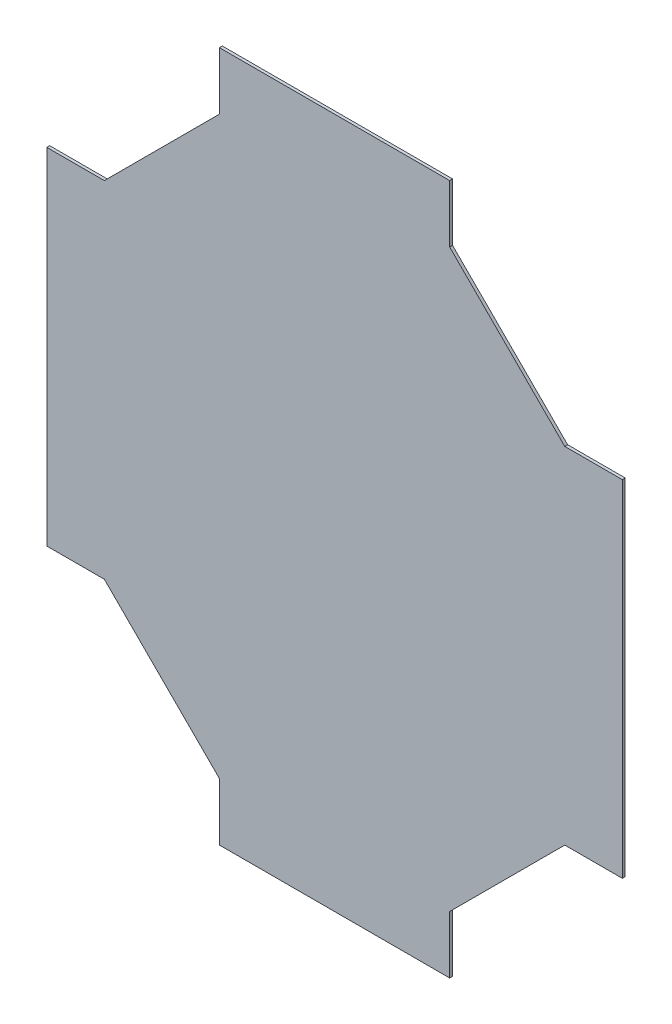
ISO-10303-21;
HEADER;
FILE_DESCRIPTION(('STEP AP214'),'2;1');
FILE_NAME('part.step','',(''),(''),'','','');
FILE_SCHEMA(('AUTOMOTIVE_DESIGN { 1 0 10303 214 1 1 1 1 }'));
ENDSEC;
DATA;
#1=APPLICATION_CONTEXT('core data for automotive mechanical design processes');
#2=APPLICATION_PROTOCOL_DEFINITION('international standard','automotive_design',2000,#1);
#3=PRODUCT_CONTEXT('',#1,'mechanical');
#4=PRODUCT('Part','Part','',(#3));
#5=PRODUCT_RELATED_PRODUCT_CATEGORY('part','',(#4));
#6=PRODUCT_DEFINITION_FORMATION('','',#4);
#7=PRODUCT_DEFINITION_CONTEXT('part definition',#1,'design');
#8=PRODUCT_DEFINITION('design','',#6,#7);
#9=PRODUCT_DEFINITION_SHAPE('','',#8);
#10=(LENGTH_UNIT() NAMED_UNIT(*) SI_UNIT(.MILLI.,.METRE.));
#11=(NAMED_UNIT(*) PLANE_ANGLE_UNIT() SI_UNIT($,.RADIAN.));
#12=(NAMED_UNIT(*) SI_UNIT($,.STERADIAN.) SOLID_ANGLE_UNIT());
#13=UNCERTAINTY_MEASURE_WITH_UNIT(LENGTH_MEASURE(1.E-05),#10,'distance_accuracy_value','');
#14=(GEOMETRIC_REPRESENTATION_CONTEXT(3) GLOBAL_UNCERTAINTY_ASSIGNED_CONTEXT((#13)) GLOBAL_UNIT_ASSIGNED_CONTEXT((#10,
#11,#12)) REPRESENTATION_CONTEXT('',''));
#15=CARTESIAN_POINT('',(0.,0.,0.));
#16=DIRECTION('',(0.,0.,1.));
#17=DIRECTION('',(1.,0.,0.));
#18=AXIS2_PLACEMENT_3D('',#15,#16,#17);
#19=CARTESIAN_POINT('',(317.5,381.,3.175));
#20=DIRECTION('',(-1.,0.,0.));
#21=DIRECTION('',(0.,0.,1.));
#22=AXIS2_PLACEMENT_3D('',#19,#20,#21);
#23=PLANE('',#22);
#24=DIRECTION('',(0.,0.,1.));
#25=VECTOR('',#24,1.);
#26=CARTESIAN_POINT('',(317.5,190.5,0.));
#27=LINE('',#26,#25);
#28=CARTESIAN_POINT('',(317.5,190.5,0.));
#29=VERTEX_POINT('',#28);
#30=CARTESIAN_POINT('',(317.5,190.5,3.175));
#31=VERTEX_POINT('',#30);
#32=EDGE_CURVE('E221',#29,#31,#27,.T.);
#33=ORIENTED_EDGE('',*,*,#32,.T.);
#34=DIRECTION('',(0.,1.,0.));
#35=VECTOR('',#34,1.);
#36=CARTESIAN_POINT('',(317.5,381.,3.175));
#37=LINE('',#36,#35);
#38=CARTESIAN_POINT('',(317.5,-190.5,3.175));
#39=VERTEX_POINT('',#38);
#40=EDGE_CURVE('E195',#39,#31,#37,.T.);
#41=ORIENTED_EDGE('',*,*,#40,.F.);
#42=DIRECTION('',(0.,0.,1.));
#43=VECTOR('',#42,1.);
#44=CARTESIAN_POINT('',(317.5,-190.5,0.));
#45=LINE('',#44,#43);
#46=CARTESIAN_POINT('',(317.5,-190.5,0.));
#47=VERTEX_POINT('',#46);
#48=EDGE_CURVE('E219',#47,#39,#45,.T.);
#49=ORIENTED_EDGE('',*,*,#48,.F.);
#50=DIRECTION('',(0.,1.,0.));
#51=VECTOR('',#50,1.);
#52=CARTESIAN_POINT('',(317.5,381.,0.));
#53=LINE('',#52,#51);
#54=EDGE_CURVE('E186',#47,#29,#53,.T.);
#55=ORIENTED_EDGE('',*,*,#54,.T.);
#56=EDGE_LOOP('',(#33,#41,#49,#55));
#57=FACE_BOUND('',#56,.T.);
#58=ADVANCED_FACE('F45',(#57),#23,.F.);
#59=CARTESIAN_POINT('',(-317.5,381.,3.175));
#60=DIRECTION('',(0.,-1.,0.));
#61=DIRECTION('',(1.,0.,0.));
#62=AXIS2_PLACEMENT_3D('',#59,#60,#61);
#63=PLANE('',#62);
#64=DIRECTION('',(0.,0.,1.));
#65=VECTOR('',#64,1.);
#66=CARTESIAN_POINT('',(127.,381.,0.));
#67=LINE('',#66,#65);
#68=CARTESIAN_POINT('',(127.,381.,0.));
#69=VERTEX_POINT('',#68);
#70=CARTESIAN_POINT('',(127.,381.,3.175));
#71=VERTEX_POINT('',#70);
#72=EDGE_CURVE('E164',#69,#71,#67,.T.);
#73=ORIENTED_EDGE('',*,*,#72,.F.);
#74=DIRECTION('',(-1.,0.,0.));
#75=VECTOR('',#74,1.);
#76=CARTESIAN_POINT('',(-317.5,381.,0.));
#77=LINE('',#76,#75);
#78=CARTESIAN_POINT('',(-127.,381.,0.));
#79=VERTEX_POINT('',#78);
#80=EDGE_CURVE('E178',#69,#79,#77,.T.);
#81=ORIENTED_EDGE('',*,*,#80,.T.);
#82=DIRECTION('',(0.,0.,1.));
#83=VECTOR('',#82,1.);
#84=CARTESIAN_POINT('',(-127.,381.,0.));
#85=LINE('',#84,#83);
#86=CARTESIAN_POINT('',(-127.,381.,3.175));
#87=VERTEX_POINT('',#86);
#88=EDGE_CURVE('E61',#79,#87,#85,.T.);
#89=ORIENTED_EDGE('',*,*,#88,.T.);
#90=DIRECTION('',(-1.,0.,0.));
#91=VECTOR('',#90,1.);
#92=CARTESIAN_POINT('',(-317.5,381.,3.175));
#93=LINE('',#92,#91);
#94=EDGE_CURVE('E180',#71,#87,#93,.T.);
#95=ORIENTED_EDGE('',*,*,#94,.F.);
#96=EDGE_LOOP('',(#73,#81,#89,#95));
#97=FACE_BOUND('',#96,.T.);
#98=ADVANCED_FACE('F177',(#97),#63,.F.);
#99=CARTESIAN_POINT('',(-317.5,381.,3.175));
#100=DIRECTION('',(1.,0.,0.));
#101=DIRECTION('',(0.,0.,-1.));
#102=AXIS2_PLACEMENT_3D('',#99,#100,#101);
#103=PLANE('',#102);
#104=DIRECTION('',(0.,0.,1.));
#105=VECTOR('',#104,1.);
#106=CARTESIAN_POINT('',(-317.5,-190.5,0.));
#107=LINE('',#106,#105);
#108=CARTESIAN_POINT('',(-317.5,-190.5,0.));
#109=VERTEX_POINT('',#108);
#110=CARTESIAN_POINT('',(-317.5,-190.5,3.175));
#111=VERTEX_POINT('',#110);
#112=EDGE_CURVE('E69',#109,#111,#107,.T.);
#113=ORIENTED_EDGE('',*,*,#112,.T.);
#114=DIRECTION('',(0.,-1.,0.));
#115=VECTOR('',#114,1.);
#116=CARTESIAN_POINT('',(-317.5,381.,3.175));
#117=LINE('',#116,#115);
#118=CARTESIAN_POINT('',(-317.5,190.5,3.175));
#119=VERTEX_POINT('',#118);
#120=EDGE_CURVE('E53',#119,#111,#117,.T.);
#121=ORIENTED_EDGE('',*,*,#120,.F.);
#122=DIRECTION('',(0.,0.,1.));
#123=VECTOR('',#122,1.);
#124=CARTESIAN_POINT('',(-317.5,190.5,0.));
#125=LINE('',#124,#123);
#126=CARTESIAN_POINT('',(-317.5,190.5,0.));
#127=VERTEX_POINT('',#126);
#128=EDGE_CURVE('E203',#127,#119,#125,.T.);
#129=ORIENTED_EDGE('',*,*,#128,.F.);
#130=DIRECTION('',(0.,-1.,0.));
#131=VECTOR('',#130,1.);
#132=CARTESIAN_POINT('',(-317.5,381.,0.));
#133=LINE('',#132,#131);
#134=EDGE_CURVE('E185',#127,#109,#133,.T.);
#135=ORIENTED_EDGE('',*,*,#134,.T.);
#136=EDGE_LOOP('',(#113,#121,#129,#135));
#137=FACE_BOUND('',#136,.T.);
#138=ADVANCED_FACE('F329',(#137),#103,.F.);
#139=CARTESIAN_POINT('',(-317.5,-381.,3.175));
#140=DIRECTION('',(0.,1.,0.));
#141=DIRECTION('',(-1.,0.,0.));
#142=AXIS2_PLACEMENT_3D('',#139,#140,#141);
#143=PLANE('',#142);
#144=DIRECTION('',(0.,0.,1.));
#145=VECTOR('',#144,1.);
#146=CARTESIAN_POINT('',(127.,-381.,0.));
#147=LINE('',#146,#145);
#148=CARTESIAN_POINT('',(127.,-381.,0.));
#149=VERTEX_POINT('',#148);
#150=CARTESIAN_POINT('',(127.,-381.,3.175));
#151=VERTEX_POINT('',#150);
#152=EDGE_CURVE('E212',#149,#151,#147,.T.);
#153=ORIENTED_EDGE('',*,*,#152,.T.);
#154=DIRECTION('',(1.,0.,0.));
#155=VECTOR('',#154,1.);
#156=CARTESIAN_POINT('',(-317.5,-381.,3.175));
#157=LINE('',#156,#155);
#158=CARTESIAN_POINT('',(-127.,-381.,3.175));
#159=VERTEX_POINT('',#158);
#160=EDGE_CURVE('E11',#159,#151,#157,.T.);
#161=ORIENTED_EDGE('',*,*,#160,.F.);
#162=DIRECTION('',(0.,0.,1.));
#163=VECTOR('',#162,1.);
#164=CARTESIAN_POINT('',(-127.,-381.,0.));
#165=LINE('',#164,#163);
#166=CARTESIAN_POINT('',(-127.,-381.,0.));
#167=VERTEX_POINT('',#166);
#168=EDGE_CURVE('E210',#167,#159,#165,.T.);
#169=ORIENTED_EDGE('',*,*,#168,.F.);
#170=DIRECTION('',(1.,0.,0.));
#171=VECTOR('',#170,1.);
#172=CARTESIAN_POINT('',(-317.5,-381.,0.));
#173=LINE('',#172,#171);
#174=EDGE_CURVE('E48',#167,#149,#173,.T.);
#175=ORIENTED_EDGE('',*,*,#174,.T.);
#176=EDGE_LOOP('',(#153,#161,#169,#175));
#177=FACE_BOUND('',#176,.T.);
#178=ADVANCED_FACE('F318',(#177),#143,.F.);
#179=CARTESIAN_POINT('',(0.,0.,3.175));
#180=DIRECTION('',(0.,0.,1.));
#181=DIRECTION('',(1.,0.,0.));
#182=AXIS2_PLACEMENT_3D('',#179,#180,#181);
#183=PLANE('',#182);
#184=DIRECTION('',(-0.707106781186547,0.707106781186548,0.));
#185=VECTOR('',#184,1.);
#186=CARTESIAN_POINT('',(127.,317.5,3.175));
#187=LINE('',#186,#185);
#188=CARTESIAN_POINT('',(254.,190.5,3.175));
#189=VERTEX_POINT('',#188);
#190=CARTESIAN_POINT('',(127.,317.5,3.175));
#191=VERTEX_POINT('',#190);
#192=EDGE_CURVE('E172',#189,#191,#187,.T.);
#193=ORIENTED_EDGE('',*,*,#192,.T.);
#194=DIRECTION('',(0.,1.,0.));
#195=VECTOR('',#194,1.);
#196=CARTESIAN_POINT('',(127.,381.,3.175));
#197=LINE('',#196,#195);
#198=EDGE_CURVE('E259',#191,#71,#197,.T.);
#199=ORIENTED_EDGE('',*,*,#198,.T.);
#200=ORIENTED_EDGE('',*,*,#94,.T.);
#201=DIRECTION('',(0.,-1.,0.));
#202=VECTOR('',#201,1.);
#203=CARTESIAN_POINT('',(-127.,381.,3.175));
#204=LINE('',#203,#202);
#205=CARTESIAN_POINT('',(-127.,317.5,3.175));
#206=VERTEX_POINT('',#205);
#207=EDGE_CURVE('E256',#87,#206,#204,.T.);
#208=ORIENTED_EDGE('',*,*,#207,.T.);
#209=DIRECTION('',(-0.707106781186548,-0.707106781186547,0.));
#210=VECTOR('',#209,1.);
#211=CARTESIAN_POINT('',(-254.,190.5,3.175));
#212=LINE('',#211,#210);
#213=CARTESIAN_POINT('',(-254.,190.5,3.175));
#214=VERTEX_POINT('',#213);
#215=EDGE_CURVE('E253',#206,#214,#212,.T.);
#216=ORIENTED_EDGE('',*,*,#215,.T.);
#217=DIRECTION('',(-1.,0.,0.));
#218=VECTOR('',#217,1.);
#219=CARTESIAN_POINT('',(-317.5,190.5,3.175));
#220=LINE('',#219,#218);
#221=EDGE_CURVE('E250',#214,#119,#220,.T.);
#222=ORIENTED_EDGE('',*,*,#221,.T.);
#223=ORIENTED_EDGE('',*,*,#120,.T.);
#224=DIRECTION('',(1.,0.,0.));
#225=VECTOR('',#224,1.);
#226=CARTESIAN_POINT('',(-317.5,-190.5,3.175));
#227=LINE('',#226,#225);
#228=CARTESIAN_POINT('',(-254.,-190.5,3.175));
#229=VERTEX_POINT('',#228);
#230=EDGE_CURVE('E247',#111,#229,#227,.T.);
#231=ORIENTED_EDGE('',*,*,#230,.T.);
#232=DIRECTION('',(0.707106781186546,-0.707106781186549,0.));
#233=VECTOR('',#232,1.);
#234=CARTESIAN_POINT('',(-254.,-190.5,3.175));
#235=LINE('',#234,#233);
#236=CARTESIAN_POINT('',(-127.,-317.5,3.175));
#237=VERTEX_POINT('',#236);
#238=EDGE_CURVE('E244',#229,#237,#235,.T.);
#239=ORIENTED_EDGE('',*,*,#238,.T.);
#240=DIRECTION('',(0.,-1.,0.));
#241=VECTOR('',#240,1.);
#242=CARTESIAN_POINT('',(-127.,-381.,3.175));
#243=LINE('',#242,#241);
#244=EDGE_CURVE('E241',#237,#159,#243,.T.);
#245=ORIENTED_EDGE('',*,*,#244,.T.);
#246=ORIENTED_EDGE('',*,*,#160,.T.);
#247=DIRECTION('',(0.,1.,0.));
#248=VECTOR('',#247,1.);
#249=CARTESIAN_POINT('',(127.,-381.,3.175));
#250=LINE('',#249,#248);
#251=CARTESIAN_POINT('',(127.,-317.5,3.175));
#252=VERTEX_POINT('',#251);
#253=EDGE_CURVE('E238',#151,#252,#250,.T.);
#254=ORIENTED_EDGE('',*,*,#253,.T.);
#255=DIRECTION('',(0.707106781186547,0.707106781186548,0.));
#256=VECTOR('',#255,1.);
#257=CARTESIAN_POINT('',(127.,-317.5,3.175));
#258=LINE('',#257,#256);
#259=CARTESIAN_POINT('',(254.,-190.5,3.175));
#260=VERTEX_POINT('',#259);
#261=EDGE_CURVE('E235',#252,#260,#258,.T.);
#262=ORIENTED_EDGE('',*,*,#261,.T.);
#263=DIRECTION('',(1.,0.,0.));
#264=VECTOR('',#263,1.);
#265=CARTESIAN_POINT('',(317.5,-190.5,3.175));
#266=LINE('',#265,#264);
#267=EDGE_CURVE('E232',#260,#39,#266,.T.);
#268=ORIENTED_EDGE('',*,*,#267,.T.);
#269=ORIENTED_EDGE('',*,*,#40,.T.);
#270=DIRECTION('',(-1.,0.,0.));
#271=VECTOR('',#270,1.);
#272=CARTESIAN_POINT('',(317.5,190.5,3.175));
#273=LINE('',#272,#271);
#274=EDGE_CURVE('E229',#31,#189,#273,.T.);
#275=ORIENTED_EDGE('',*,*,#274,.T.);
#276=EDGE_LOOP('',(#193,#199,#200,#208,#216,#222,#223,#231,#239,#245,#246,#254,#262,#268,#269,#275));
#277=FACE_BOUND('',#276,.T.);
#278=ADVANCED_FACE('F293',(#277),#183,.T.);
#279=CARTESIAN_POINT('',(0.,0.,0.));
#280=DIRECTION('',(0.,0.,1.));
#281=DIRECTION('',(1.,0.,0.));
#282=AXIS2_PLACEMENT_3D('',#279,#280,#281);
#283=PLANE('',#282);
#284=DIRECTION('',(0.,1.,0.));
#285=VECTOR('',#284,1.);
#286=CARTESIAN_POINT('',(127.,381.,0.));
#287=LINE('',#286,#285);
#288=CARTESIAN_POINT('',(127.,317.5,0.));
#289=VERTEX_POINT('',#288);
#290=EDGE_CURVE('E160',#289,#69,#287,.T.);
#291=ORIENTED_EDGE('',*,*,#290,.F.);
#292=DIRECTION('',(-0.707106781186547,0.707106781186548,0.));
#293=VECTOR('',#292,1.);
#294=CARTESIAN_POINT('',(127.,317.5,0.));
#295=LINE('',#294,#293);
#296=CARTESIAN_POINT('',(254.,190.5,0.));
#297=VERTEX_POINT('',#296);
#298=EDGE_CURVE('E181',#297,#289,#295,.T.);
#299=ORIENTED_EDGE('',*,*,#298,.F.);
#300=DIRECTION('',(-1.,0.,0.));
#301=VECTOR('',#300,1.);
#302=CARTESIAN_POINT('',(317.5,190.5,0.));
#303=LINE('',#302,#301);
#304=EDGE_CURVE('E262',#29,#297,#303,.T.);
#305=ORIENTED_EDGE('',*,*,#304,.F.);
#306=ORIENTED_EDGE('',*,*,#54,.F.);
#307=DIRECTION('',(1.,0.,0.));
#308=VECTOR('',#307,1.);
#309=CARTESIAN_POINT('',(317.5,-190.5,0.));
#310=LINE('',#309,#308);
#311=CARTESIAN_POINT('',(254.,-190.5,0.));
#312=VERTEX_POINT('',#311);
#313=EDGE_CURVE('E265',#312,#47,#310,.T.);
#314=ORIENTED_EDGE('',*,*,#313,.F.);
#315=DIRECTION('',(0.707106781186547,0.707106781186548,0.));
#316=VECTOR('',#315,1.);
#317=CARTESIAN_POINT('',(127.,-317.5,0.));
#318=LINE('',#317,#316);
#319=CARTESIAN_POINT('',(127.,-317.5,0.));
#320=VERTEX_POINT('',#319);
#321=EDGE_CURVE('E267',#320,#312,#318,.T.);
#322=ORIENTED_EDGE('',*,*,#321,.F.);
#323=DIRECTION('',(0.,1.,0.));
#324=VECTOR('',#323,1.);
#325=CARTESIAN_POINT('',(127.,-381.,0.));
#326=LINE('',#325,#324);
#327=EDGE_CURVE('E270',#149,#320,#326,.T.);
#328=ORIENTED_EDGE('',*,*,#327,.F.);
#329=ORIENTED_EDGE('',*,*,#174,.F.);
#330=DIRECTION('',(0.,-1.,0.));
#331=VECTOR('',#330,1.);
#332=CARTESIAN_POINT('',(-127.,-381.,0.));
#333=LINE('',#332,#331);
#334=CARTESIAN_POINT('',(-127.,-317.5,0.));
#335=VERTEX_POINT('',#334);
#336=EDGE_CURVE('E273',#335,#167,#333,.T.);
#337=ORIENTED_EDGE('',*,*,#336,.F.);
#338=DIRECTION('',(0.707106781186546,-0.707106781186549,0.));
#339=VECTOR('',#338,1.);
#340=CARTESIAN_POINT('',(-254.,-190.5,0.));
#341=LINE('',#340,#339);
#342=CARTESIAN_POINT('',(-254.,-190.5,0.));
#343=VERTEX_POINT('',#342);
#344=EDGE_CURVE('E275',#343,#335,#341,.T.);
#345=ORIENTED_EDGE('',*,*,#344,.F.);
#346=DIRECTION('',(1.,0.,0.));
#347=VECTOR('',#346,1.);
#348=CARTESIAN_POINT('',(-317.5,-190.5,0.));
#349=LINE('',#348,#347);
#350=EDGE_CURVE('E278',#109,#343,#349,.T.);
#351=ORIENTED_EDGE('',*,*,#350,.F.);
#352=ORIENTED_EDGE('',*,*,#134,.F.);
#353=DIRECTION('',(-1.,0.,0.));
#354=VECTOR('',#353,1.);
#355=CARTESIAN_POINT('',(-317.5,190.5,0.));
#356=LINE('',#355,#354);
#357=CARTESIAN_POINT('',(-254.,190.5,0.));
#358=VERTEX_POINT('',#357);
#359=EDGE_CURVE('E280',#358,#127,#356,.T.);
#360=ORIENTED_EDGE('',*,*,#359,.F.);
#361=DIRECTION('',(-0.707106781186548,-0.707106781186547,0.));
#362=VECTOR('',#361,1.);
#363=CARTESIAN_POINT('',(-254.,190.5,0.));
#364=LINE('',#363,#362);
#365=CARTESIAN_POINT('',(-127.,317.5,0.));
#366=VERTEX_POINT('',#365);
#367=EDGE_CURVE('E282',#366,#358,#364,.T.);
#368=ORIENTED_EDGE('',*,*,#367,.F.);
#369=DIRECTION('',(0.,-1.,0.));
#370=VECTOR('',#369,1.);
#371=CARTESIAN_POINT('',(-127.,381.,0.));
#372=LINE('',#371,#370);
#373=EDGE_CURVE('E171',#79,#366,#372,.T.);
#374=ORIENTED_EDGE('',*,*,#373,.F.);
#375=ORIENTED_EDGE('',*,*,#80,.F.);
#376=EDGE_LOOP('',(#291,#299,#305,#306,#314,#322,#328,#329,#337,#345,#351,#352,#360,#368,#374,#375));
#377=FACE_BOUND('',#376,.T.);
#378=ADVANCED_FACE('F183',(#377),#283,.F.);
#379=CARTESIAN_POINT('',(-127.,381.,0.));
#380=DIRECTION('',(-1.,0.,0.));
#381=DIRECTION('',(0.,0.,1.));
#382=AXIS2_PLACEMENT_3D('',#379,#380,#381);
#383=PLANE('',#382);
#384=ORIENTED_EDGE('',*,*,#207,.F.);
#385=ORIENTED_EDGE('',*,*,#88,.F.);
#386=ORIENTED_EDGE('',*,*,#373,.T.);
#387=DIRECTION('',(0.,0.,1.));
#388=VECTOR('',#387,1.);
#389=CARTESIAN_POINT('',(-127.,317.5,0.));
#390=LINE('',#389,#388);
#391=EDGE_CURVE('E199',#366,#206,#390,.T.);
#392=ORIENTED_EDGE('',*,*,#391,.T.);
#393=EDGE_LOOP('',(#384,#385,#386,#392));
#394=FACE_BOUND('',#393,.T.);
#395=ADVANCED_FACE('F285',(#394),#383,.T.);
#396=CARTESIAN_POINT('',(-254.,190.5,0.));
#397=DIRECTION('',(-0.707106781186547,0.707106781186548,0.));
#398=DIRECTION('',(-0.707106781186548,-0.707106781186547,0.));
#399=AXIS2_PLACEMENT_3D('',#396,#397,#398);
#400=PLANE('',#399);
#401=ORIENTED_EDGE('',*,*,#215,.F.);
#402=ORIENTED_EDGE('',*,*,#391,.F.);
#403=ORIENTED_EDGE('',*,*,#367,.T.);
#404=DIRECTION('',(0.,0.,1.));
#405=VECTOR('',#404,1.);
#406=CARTESIAN_POINT('',(-254.,190.5,0.));
#407=LINE('',#406,#405);
#408=EDGE_CURVE('E201',#358,#214,#407,.T.);
#409=ORIENTED_EDGE('',*,*,#408,.T.);
#410=EDGE_LOOP('',(#401,#402,#403,#409));
#411=FACE_BOUND('',#410,.T.);
#412=ADVANCED_FACE('F290',(#411),#400,.T.);
#413=CARTESIAN_POINT('',(-317.5,190.5,0.));
#414=DIRECTION('',(0.,1.,0.));
#415=DIRECTION('',(0.,0.,1.));
#416=AXIS2_PLACEMENT_3D('',#413,#414,#415);
#417=PLANE('',#416);
#418=ORIENTED_EDGE('',*,*,#221,.F.);
#419=ORIENTED_EDGE('',*,*,#408,.F.);
#420=ORIENTED_EDGE('',*,*,#359,.T.);
#421=ORIENTED_EDGE('',*,*,#128,.T.);
#422=EDGE_LOOP('',(#418,#419,#420,#421));
#423=FACE_BOUND('',#422,.T.);
#424=ADVANCED_FACE('F332',(#423),#417,.T.);
#425=CARTESIAN_POINT('',(-317.5,-190.5,0.));
#426=DIRECTION('',(0.,-1.,0.));
#427=DIRECTION('',(0.,0.,-1.));
#428=AXIS2_PLACEMENT_3D('',#425,#426,#427);
#429=PLANE('',#428);
#430=ORIENTED_EDGE('',*,*,#230,.F.);
#431=ORIENTED_EDGE('',*,*,#112,.F.);
#432=ORIENTED_EDGE('',*,*,#350,.T.);
#433=DIRECTION('',(0.,0.,1.));
#434=VECTOR('',#433,1.);
#435=CARTESIAN_POINT('',(-254.,-190.5,0.));
#436=LINE('',#435,#434);
#437=EDGE_CURVE('E206',#343,#229,#436,.T.);
#438=ORIENTED_EDGE('',*,*,#437,.T.);
#439=EDGE_LOOP('',(#430,#431,#432,#438));
#440=FACE_BOUND('',#439,.T.);
#441=ADVANCED_FACE('F334',(#440),#429,.T.);
#442=CARTESIAN_POINT('',(-254.,-190.5,0.));
#443=DIRECTION('',(-0.707106781186549,-0.707106781186546,0.));
#444=DIRECTION('',(0.707106781186546,-0.707106781186549,0.));
#445=AXIS2_PLACEMENT_3D('',#442,#443,#444);
#446=PLANE('',#445);
#447=ORIENTED_EDGE('',*,*,#238,.F.);
#448=ORIENTED_EDGE('',*,*,#437,.F.);
#449=ORIENTED_EDGE('',*,*,#344,.T.);
#450=DIRECTION('',(0.,0.,1.));
#451=VECTOR('',#450,1.);
#452=CARTESIAN_POINT('',(-127.,-317.5,0.));
#453=LINE('',#452,#451);
#454=EDGE_CURVE('E208',#335,#237,#453,.T.);
#455=ORIENTED_EDGE('',*,*,#454,.T.);
#456=EDGE_LOOP('',(#447,#448,#449,#455));
#457=FACE_BOUND('',#456,.T.);
#458=ADVANCED_FACE('F325',(#457),#446,.T.);
#459=CARTESIAN_POINT('',(-127.,-381.,0.));
#460=DIRECTION('',(-1.,0.,0.));
#461=DIRECTION('',(0.,0.,1.));
#462=AXIS2_PLACEMENT_3D('',#459,#460,#461);
#463=PLANE('',#462);
#464=ORIENTED_EDGE('',*,*,#244,.F.);
#465=ORIENTED_EDGE('',*,*,#454,.F.);
#466=ORIENTED_EDGE('',*,*,#336,.T.);
#467=ORIENTED_EDGE('',*,*,#168,.T.);
#468=EDGE_LOOP('',(#464,#465,#466,#467));
#469=FACE_BOUND('',#468,.T.);
#470=ADVANCED_FACE('F322',(#469),#463,.T.);
#471=CARTESIAN_POINT('',(127.,-381.,0.));
#472=DIRECTION('',(1.,0.,0.));
#473=DIRECTION('',(0.,0.,-1.));
#474=AXIS2_PLACEMENT_3D('',#471,#472,#473);
#475=PLANE('',#474);
#476=ORIENTED_EDGE('',*,*,#253,.F.);
#477=ORIENTED_EDGE('',*,*,#152,.F.);
#478=ORIENTED_EDGE('',*,*,#327,.T.);
#479=DIRECTION('',(0.,0.,1.));
#480=VECTOR('',#479,1.);
#481=CARTESIAN_POINT('',(127.,-317.5,0.));
#482=LINE('',#481,#480);
#483=EDGE_CURVE('E215',#320,#252,#482,.T.);
#484=ORIENTED_EDGE('',*,*,#483,.T.);
#485=EDGE_LOOP('',(#476,#477,#478,#484));
#486=FACE_BOUND('',#485,.T.);
#487=ADVANCED_FACE('F397',(#486),#475,.T.);
#488=CARTESIAN_POINT('',(127.,-317.5,0.));
#489=DIRECTION('',(0.707106781186548,-0.707106781186547,0.));
#490=DIRECTION('',(0.707106781186547,0.707106781186548,0.));
#491=AXIS2_PLACEMENT_3D('',#488,#489,#490);
#492=PLANE('',#491);
#493=ORIENTED_EDGE('',*,*,#261,.F.);
#494=ORIENTED_EDGE('',*,*,#483,.F.);
#495=ORIENTED_EDGE('',*,*,#321,.T.);
#496=DIRECTION('',(0.,0.,1.));
#497=VECTOR('',#496,1.);
#498=CARTESIAN_POINT('',(254.,-190.5,0.));
#499=LINE('',#498,#497);
#500=EDGE_CURVE('E217',#312,#260,#499,.T.);
#501=ORIENTED_EDGE('',*,*,#500,.T.);
#502=EDGE_LOOP('',(#493,#494,#495,#501));
#503=FACE_BOUND('',#502,.T.);
#504=ADVANCED_FACE('F309',(#503),#492,.T.);
#505=CARTESIAN_POINT('',(317.5,-190.5,0.));
#506=DIRECTION('',(0.,-1.,0.));
#507=DIRECTION('',(0.,0.,-1.));
#508=AXIS2_PLACEMENT_3D('',#505,#506,#507);
#509=PLANE('',#508);
#510=ORIENTED_EDGE('',*,*,#267,.F.);
#511=ORIENTED_EDGE('',*,*,#500,.F.);
#512=ORIENTED_EDGE('',*,*,#313,.T.);
#513=ORIENTED_EDGE('',*,*,#48,.T.);
#514=EDGE_LOOP('',(#510,#511,#512,#513));
#515=FACE_BOUND('',#514,.T.);
#516=ADVANCED_FACE('F306',(#515),#509,.T.);
#517=CARTESIAN_POINT('',(127.,381.,0.));
#518=DIRECTION('',(1.,0.,0.));
#519=DIRECTION('',(0.,0.,-1.));
#520=AXIS2_PLACEMENT_3D('',#517,#518,#519);
#521=PLANE('',#520);
#522=ORIENTED_EDGE('',*,*,#198,.F.);
#523=DIRECTION('',(0.,0.,1.));
#524=VECTOR('',#523,1.);
#525=CARTESIAN_POINT('',(127.,317.5,0.));
#526=LINE('',#525,#524);
#527=EDGE_CURVE('E166',#289,#191,#526,.T.);
#528=ORIENTED_EDGE('',*,*,#527,.F.);
#529=ORIENTED_EDGE('',*,*,#290,.T.);
#530=ORIENTED_EDGE('',*,*,#72,.T.);
#531=EDGE_LOOP('',(#522,#528,#529,#530));
#532=FACE_BOUND('',#531,.T.);
#533=ADVANCED_FACE('F163',(#532),#521,.T.);
#534=CARTESIAN_POINT('',(127.,317.5,0.));
#535=DIRECTION('',(0.707106781186548,0.707106781186547,0.));
#536=DIRECTION('',(-0.707106781186547,0.707106781186548,0.));
#537=AXIS2_PLACEMENT_3D('',#534,#535,#536);
#538=PLANE('',#537);
#539=ORIENTED_EDGE('',*,*,#192,.F.);
#540=DIRECTION('',(0.,0.,1.));
#541=VECTOR('',#540,1.);
#542=CARTESIAN_POINT('',(254.,190.5,0.));
#543=LINE('',#542,#541);
#544=EDGE_CURVE('E224',#297,#189,#543,.T.);
#545=ORIENTED_EDGE('',*,*,#544,.F.);
#546=ORIENTED_EDGE('',*,*,#298,.T.);
#547=ORIENTED_EDGE('',*,*,#527,.T.);
#548=EDGE_LOOP('',(#539,#545,#546,#547));
#549=FACE_BOUND('',#548,.T.);
#550=ADVANCED_FACE('F296',(#549),#538,.T.);
#551=CARTESIAN_POINT('',(317.5,190.5,0.));
#552=DIRECTION('',(0.,1.,0.));
#553=DIRECTION('',(0.,0.,1.));
#554=AXIS2_PLACEMENT_3D('',#551,#552,#553);
#555=PLANE('',#554);
#556=ORIENTED_EDGE('',*,*,#274,.F.);
#557=ORIENTED_EDGE('',*,*,#32,.F.);
#558=ORIENTED_EDGE('',*,*,#304,.T.);
#559=ORIENTED_EDGE('',*,*,#544,.T.);
#560=EDGE_LOOP('',(#556,#557,#558,#559));
#561=FACE_BOUND('',#560,.T.);
#562=ADVANCED_FACE('F436',(#561),#555,.T.);
#563=CLOSED_SHELL('',(#58,#98,#138,#178,#278,#378,#395,#412,#424,#441,#458,#470,#487,#504,#516,
#533,#550,#562));
#564=MANIFOLD_SOLID_BREP('B2',#563);
#565=ADVANCED_BREP_SHAPE_REPRESENTATION('',(#18,#564),#14);
#566=SHAPE_DEFINITION_REPRESENTATION(#9,#565);
ENDSEC;
END-ISO-10303-21;
